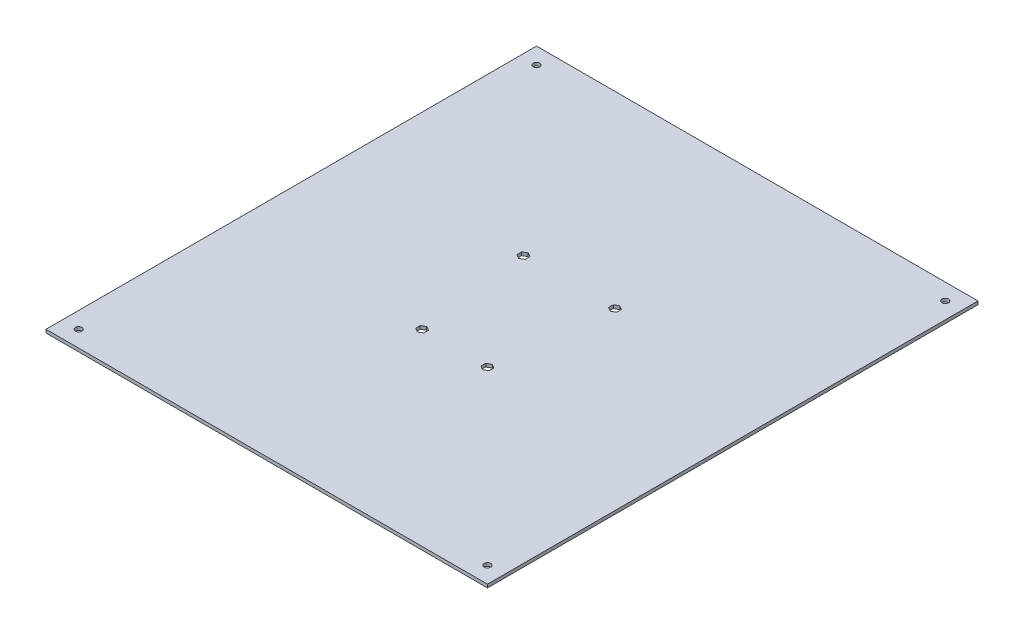
ISO-10303-21;
HEADER;
FILE_DESCRIPTION(('STEP AP214'),'2;1');
FILE_NAME('part.step','',(''),(''),'','','');
FILE_SCHEMA(('AUTOMOTIVE_DESIGN { 1 0 10303 214 1 1 1 1 }'));
ENDSEC;
DATA;
#1=APPLICATION_CONTEXT('core data for automotive mechanical design processes');
#2=APPLICATION_PROTOCOL_DEFINITION('international standard','automotive_design',2000,#1);
#3=PRODUCT_CONTEXT('',#1,'mechanical');
#4=PRODUCT('Part','Part','',(#3));
#5=PRODUCT_RELATED_PRODUCT_CATEGORY('part','',(#4));
#6=PRODUCT_DEFINITION_FORMATION('','',#4);
#7=PRODUCT_DEFINITION_CONTEXT('part definition',#1,'design');
#8=PRODUCT_DEFINITION('design','',#6,#7);
#9=PRODUCT_DEFINITION_SHAPE('','',#8);
#10=(LENGTH_UNIT() NAMED_UNIT(*) SI_UNIT(.MILLI.,.METRE.));
#11=(NAMED_UNIT(*) PLANE_ANGLE_UNIT() SI_UNIT($,.RADIAN.));
#12=(NAMED_UNIT(*) SI_UNIT($,.STERADIAN.) SOLID_ANGLE_UNIT());
#13=UNCERTAINTY_MEASURE_WITH_UNIT(LENGTH_MEASURE(1.E-05),#10,'distance_accuracy_value','');
#14=(GEOMETRIC_REPRESENTATION_CONTEXT(3) GLOBAL_UNCERTAINTY_ASSIGNED_CONTEXT((#13)) GLOBAL_UNIT_ASSIGNED_CONTEXT((#10,
#11,#12)) REPRESENTATION_CONTEXT('',''));
#15=CARTESIAN_POINT('',(0.,0.,0.));
#16=DIRECTION('',(0.,0.,1.));
#17=DIRECTION('',(1.,0.,0.));
#18=AXIS2_PLACEMENT_3D('',#15,#16,#17);
#19=CARTESIAN_POINT('',(0.,2.,0.));
#20=DIRECTION('',(0.,-1.,0.));
#21=DIRECTION('',(0.,0.,-1.));
#22=AXIS2_PLACEMENT_3D('',#19,#20,#21);
#23=PLANE('',#22);
#24=DIRECTION('',(0.856357223631022,0.,0.51638387420113));
#25=VECTOR('',#24,1.);
#26=CARTESIAN_POINT('',(123.982042371858,2.,-205.608507333663));
#27=LINE('',#26,#25);
#28=CARTESIAN_POINT('',(160.472995130533,2.,-183.604442862861));
#29=VERTEX_POINT('',#28);
#30=CARTESIAN_POINT('',(162.945085498462,2.,-182.113771018985));
#31=VERTEX_POINT('',#30);
#32=EDGE_CURVE('E242',#29,#31,#27,.T.);
#33=ORIENTED_EDGE('',*,*,#32,.F.);
#34=DIRECTION('',(-0.0190229413472933,0.,0.999819047479341));
#35=VECTOR('',#34,1.);
#36=CARTESIAN_POINT('',(156.922859863659,2.,2.9856746245851));
#37=LINE('',#36,#35);
#38=CARTESIAN_POINT('',(160.527909632071,2.,-186.490671843876));
#39=VERTEX_POINT('',#38);
#40=EDGE_CURVE('E55',#39,#29,#37,.T.);
#41=ORIENTED_EDGE('',*,*,#40,.F.);
#42=DIRECTION('',(-0.875380164978316,0.,0.483435173278213));
#43=VECTOR('',#42,1.);
#44=CARTESIAN_POINT('',(-41.4039974729137,2.,-74.9722819976583));
#45=LINE('',#44,#43);
#46=CARTESIAN_POINT('',(163.054914501538,2.,-187.886228981016));
#47=VERTEX_POINT('',#46);
#48=EDGE_CURVE('E261',#47,#39,#45,.T.);
#49=ORIENTED_EDGE('',*,*,#48,.F.);
#50=DIRECTION('',(-0.856357223631015,0.,-0.516383874201141));
#51=VECTOR('',#50,1.);
#52=CARTESIAN_POINT('',(126.563961742867,2.,-209.890293451817));
#53=LINE('',#52,#51);
#54=CARTESIAN_POINT('',(165.527004869467,2.,-186.39555713714));
#55=VERTEX_POINT('',#54);
#56=EDGE_CURVE('E254',#55,#47,#53,.T.);
#57=ORIENTED_EDGE('',*,*,#56,.F.);
#58=DIRECTION('',(0.0190229413472933,0.,-0.999819047479341));
#59=VECTOR('',#58,1.);
#60=CARTESIAN_POINT('',(161.921955101056,2.,3.08078933132156));
#61=LINE('',#60,#59);
#62=CARTESIAN_POINT('',(165.472090367929,2.,-183.509328156124));
#63=VERTEX_POINT('',#62);
#64=EDGE_CURVE('E250',#63,#55,#61,.T.);
#65=ORIENTED_EDGE('',*,*,#64,.F.);
#66=DIRECTION('',(0.875380164978318,0.,-0.48343517327821));
#67=VECTOR('',#66,1.);
#68=CARTESIAN_POINT('',(-38.9868216065229,2.,-70.5953811727678));
#69=LINE('',#68,#67);
#70=EDGE_CURVE('E231',#31,#63,#69,.T.);
#71=ORIENTED_EDGE('',*,*,#70,.F.);
#72=EDGE_LOOP('',(#33,#41,#49,#57,#65,#71));
#73=FACE_BOUND('',#72,.T.);
#74=DIRECTION('',(0.852913627072248,0.,0.522052051767315));
#75=VECTOR('',#74,1.);
#76=CARTESIAN_POINT('',(92.1438238417608,2.,-150.541929179528));
#77=LINE('',#76,#75);
#78=CARTESIAN_POINT('',(152.463795090117,2.,-113.621233163866));
#79=VERTEX_POINT('',#78);
#80=CARTESIAN_POINT('',(154.925944651046,2.,-112.114198700772));
#81=VERTEX_POINT('',#80);
#82=EDGE_CURVE('E281',#79,#81,#77,.T.);
#83=ORIENTED_EDGE('',*,*,#82,.F.);
#84=DIRECTION('',(-0.0256535253921588,0.,0.999670894162151));
#85=VECTOR('',#84,1.);
#86=CARTESIAN_POINT('',(149.449632236285,2.,3.83517211295387));
#87=LINE('',#86,#85);
#88=CARTESIAN_POINT('',(152.537850439071,2.,-116.507034463094));
#89=VERTEX_POINT('',#88);
#90=EDGE_CURVE('E63',#89,#79,#87,.T.);
#91=ORIENTED_EDGE('',*,*,#90,.F.);
#92=DIRECTION('',(-0.878567152464407,0.,0.477618842394836));
#93=VECTOR('',#92,1.);
#94=CARTESIAN_POINT('',(-14.0918105488571,2.,-25.9215105603864));
#95=LINE('',#94,#93);
#96=CARTESIAN_POINT('',(155.074055348954,2.,-117.885801299228));
#97=VERTEX_POINT('',#96);
#98=EDGE_CURVE('E298',#97,#89,#95,.T.);
#99=ORIENTED_EDGE('',*,*,#98,.F.);
#100=DIRECTION('',(-0.852913627072248,0.,-0.522052051767315));
#101=VECTOR('',#100,1.);
#102=CARTESIAN_POINT('',(94.7540841005975,2.,-154.80649731489));
#103=LINE('',#102,#101);
#104=CARTESIAN_POINT('',(157.536204909883,2.,-116.378766836134));
#105=VERTEX_POINT('',#104);
#106=EDGE_CURVE('E294',#105,#97,#103,.T.);
#107=ORIENTED_EDGE('',*,*,#106,.F.);
#108=DIRECTION('',(0.0256535253921588,0.,-0.999670894162151));
#109=VECTOR('',#108,1.);
#110=CARTESIAN_POINT('',(154.447986707096,2.,3.96343973991467));
#111=LINE('',#110,#109);
#112=CARTESIAN_POINT('',(157.462149560928,2.,-113.492965536906));
#113=VERTEX_POINT('',#112);
#114=EDGE_CURVE('E290',#113,#105,#111,.T.);
#115=ORIENTED_EDGE('',*,*,#114,.F.);
#116=DIRECTION('',(0.878567152464407,0.,-0.477618842394836));
#117=VECTOR('',#116,1.);
#118=CARTESIAN_POINT('',(-11.7037163368828,2.,-21.5286747980641));
#119=LINE('',#118,#117);
#120=EDGE_CURVE('E286',#81,#113,#119,.T.);
#121=ORIENTED_EDGE('',*,*,#120,.F.);
#122=EDGE_LOOP('',(#83,#91,#99,#107,#115,#121));
#123=FACE_BOUND('',#122,.T.);
#124=DIRECTION('',(-0.878567152464388,0.,-0.47761884239487));
#125=VECTOR('',#124,1.);
#126=CARTESIAN_POINT('',(75.6841453737209,2.,-139.218971668453));
#127=LINE('',#126,#125);
#128=CARTESIAN_POINT('',(117.462149560928,2.,-116.507034463094));
#129=VERTEX_POINT('',#128);
#130=CARTESIAN_POINT('',(114.925944651046,2.,-117.885801299228));
#131=VERTEX_POINT('',#130);
#132=EDGE_CURVE('E323',#129,#131,#127,.T.);
#133=ORIENTED_EDGE('',*,*,#132,.F.);
#134=DIRECTION('',(-0.025653525392122,0.,-0.999670894162152));
#135=VECTOR('',#134,1.);
#136=CARTESIAN_POINT('',(120.372679855148,2.,-3.08900020718311));
#137=LINE('',#136,#135);
#138=CARTESIAN_POINT('',(117.536204909882,2.,-113.621233163866));
#139=VERTEX_POINT('',#138);
#140=EDGE_CURVE('E320',#139,#129,#137,.T.);
#141=ORIENTED_EDGE('',*,*,#140,.F.);
#142=DIRECTION('',(0.852913627072268,0.,-0.522052051767282));
#143=VECTOR('',#142,1.);
#144=CARTESIAN_POINT('',(-18.5584707580579,2.,-30.3202957513246));
#145=LINE('',#144,#143);
#146=CARTESIAN_POINT('',(115.074055348954,2.,-112.114198700772));
#147=VERTEX_POINT('',#146);
#148=EDGE_CURVE('E340',#147,#139,#145,.T.);
#149=ORIENTED_EDGE('',*,*,#148,.F.);
#150=DIRECTION('',(0.87856715246439,0.,0.477618842394869));
#151=VECTOR('',#150,1.);
#152=CARTESIAN_POINT('',(73.2960511617462,2.,-134.826135906131));
#153=LINE('',#152,#151);
#154=CARTESIAN_POINT('',(112.537850439072,2.,-113.492965536906));
#155=VERTEX_POINT('',#154);
#156=EDGE_CURVE('E336',#155,#147,#153,.T.);
#157=ORIENTED_EDGE('',*,*,#156,.F.);
#158=DIRECTION('',(0.0256535253921218,0.,0.999670894162152));
#159=VECTOR('',#158,1.);
#160=CARTESIAN_POINT('',(115.374325384337,2.,-2.96073258022248));
#161=LINE('',#160,#159);
#162=CARTESIAN_POINT('',(112.463795090118,2.,-116.378766836134));
#163=VERTEX_POINT('',#162);
#164=EDGE_CURVE('E332',#163,#155,#161,.T.);
#165=ORIENTED_EDGE('',*,*,#164,.F.);
#166=DIRECTION('',(-0.852913627072266,0.,0.522052051767284));
#167=VECTOR('',#166,1.);
#168=CARTESIAN_POINT('',(-21.1687310168942,2.,-34.5848638866855));
#169=LINE('',#168,#167);
#170=EDGE_CURVE('E328',#131,#163,#169,.T.);
#171=ORIENTED_EDGE('',*,*,#170,.F.);
#172=EDGE_LOOP('',(#133,#141,#149,#157,#165,#171));
#173=FACE_BOUND('',#172,.T.);
#174=DIRECTION('',(-0.875380164978322,0.,-0.483435173278203));
#175=VECTOR('',#174,1.);
#176=CARTESIAN_POINT('',(104.505580498796,2.,-189.233463667622));
#177=LINE('',#176,#175);
#178=CARTESIAN_POINT('',(109.472090367929,2.,-186.490671843876));
#179=VERTEX_POINT('',#178);
#180=CARTESIAN_POINT('',(106.945085498462,2.,-187.886228981015));
#181=VERTEX_POINT('',#180);
#182=EDGE_CURVE('E365',#179,#181,#177,.T.);
#183=ORIENTED_EDGE('',*,*,#182,.F.);
#184=DIRECTION('',(-0.0190229413472837,0.,-0.999819047479342));
#185=VECTOR('',#184,1.);
#186=CARTESIAN_POINT('',(112.979434616013,2.,-2.14959013190244));
#187=LINE('',#186,#185);
#188=CARTESIAN_POINT('',(109.527004869467,2.,-183.604442862861));
#189=VERTEX_POINT('',#188);
#190=EDGE_CURVE('E362',#189,#179,#187,.T.);
#191=ORIENTED_EDGE('',*,*,#190,.F.);
#192=DIRECTION('',(0.856357223631026,0.,-0.516383874201123));
#193=VECTOR('',#192,1.);
#194=CARTESIAN_POINT('',(-51.9859198774171,2.,-86.2120609072131));
#195=LINE('',#194,#193);
#196=CARTESIAN_POINT('',(107.054914501538,2.,-182.113771018985));
#197=VERTEX_POINT('',#196);
#198=EDGE_CURVE('E381',#197,#189,#195,.T.);
#199=ORIENTED_EDGE('',*,*,#198,.F.);
#200=DIRECTION('',(0.875380164978311,0.,0.483435173278223));
#201=VECTOR('',#200,1.);
#202=CARTESIAN_POINT('',(102.08840463241,2.,-184.856562842729));
#203=LINE('',#202,#201);
#204=CARTESIAN_POINT('',(104.527909632071,2.,-183.509328156124));
#205=VERTEX_POINT('',#204);
#206=EDGE_CURVE('E377',#205,#197,#203,.T.);
#207=ORIENTED_EDGE('',*,*,#206,.F.);
#208=DIRECTION('',(0.0190229413472842,0.,0.999819047479342));
#209=VECTOR('',#208,1.);
#210=CARTESIAN_POINT('',(107.980339378617,2.,-2.05447542516609));
#211=LINE('',#210,#209);
#212=CARTESIAN_POINT('',(104.472995130533,2.,-186.39555713714));
#213=VERTEX_POINT('',#212);
#214=EDGE_CURVE('E373',#213,#205,#211,.T.);
#215=ORIENTED_EDGE('',*,*,#214,.F.);
#216=DIRECTION('',(-0.856357223631027,0.,0.516383874201121));
#217=VECTOR('',#216,1.);
#218=CARTESIAN_POINT('',(-54.5678392484226,2.,-90.4938470253685));
#219=LINE('',#218,#217);
#220=EDGE_CURVE('E369',#181,#213,#219,.T.);
#221=ORIENTED_EDGE('',*,*,#220,.F.);
#222=EDGE_LOOP('',(#183,#191,#199,#207,#215,#221));
#223=FACE_BOUND('',#222,.T.);
#224=DIRECTION('',(0.,0.,1.));
#225=VECTOR('',#224,1.);
#226=CARTESIAN_POINT('',(0.,2.,0.));
#227=LINE('',#226,#225);
#228=CARTESIAN_POINT('',(0.,2.,-300.));
#229=VERTEX_POINT('',#228);
#230=CARTESIAN_POINT('',(0.,2.,0.));
#231=VERTEX_POINT('',#230);
#232=EDGE_CURVE('E435',#229,#231,#227,.T.);
#233=ORIENTED_EDGE('',*,*,#232,.T.);
#234=DIRECTION('',(1.,0.,0.));
#235=VECTOR('',#234,1.);
#236=CARTESIAN_POINT('',(0.,2.,0.));
#237=LINE('',#236,#235);
#238=CARTESIAN_POINT('',(270.,2.,0.));
#239=VERTEX_POINT('',#238);
#240=EDGE_CURVE('E439',#231,#239,#237,.T.);
#241=ORIENTED_EDGE('',*,*,#240,.T.);
#242=DIRECTION('',(0.,0.,-1.));
#243=VECTOR('',#242,1.);
#244=CARTESIAN_POINT('',(270.,2.,0.));
#245=LINE('',#244,#243);
#246=CARTESIAN_POINT('',(270.,2.,-300.));
#247=VERTEX_POINT('',#246);
#248=EDGE_CURVE('E443',#239,#247,#245,.T.);
#249=ORIENTED_EDGE('',*,*,#248,.T.);
#250=DIRECTION('',(-1.,0.,0.));
#251=VECTOR('',#250,1.);
#252=CARTESIAN_POINT('',(0.,2.,-300.));
#253=LINE('',#252,#251);
#254=EDGE_CURVE('E446',#247,#229,#253,.T.);
#255=ORIENTED_EDGE('',*,*,#254,.T.);
#256=EDGE_LOOP('',(#233,#241,#249,#255));
#257=FACE_BOUND('',#256,.T.);
#258=CARTESIAN_POINT('',(10.,2.,-290.));
#259=DIRECTION('',(0.,1.,0.));
#260=DIRECTION('',(0.,0.,1.));
#261=AXIS2_PLACEMENT_3D('',#258,#259,#260);
#262=CIRCLE('',#261,2.);
#263=CARTESIAN_POINT('',(10.,2.,-288.));
#264=VERTEX_POINT('',#263);
#265=EDGE_CURVE('E427',#264,#264,#262,.T.);
#266=ORIENTED_EDGE('',*,*,#265,.F.);
#267=EDGE_LOOP('',(#266));
#268=FACE_BOUND('',#267,.T.);
#269=CARTESIAN_POINT('',(10.,2.,-10.));
#270=DIRECTION('',(0.,1.,0.));
#271=DIRECTION('',(0.,0.,-1.));
#272=AXIS2_PLACEMENT_3D('',#269,#270,#271);
#273=CIRCLE('',#272,2.);
#274=CARTESIAN_POINT('',(10.,2.,-12.));
#275=VERTEX_POINT('',#274);
#276=EDGE_CURVE('E419',#275,#275,#273,.T.);
#277=ORIENTED_EDGE('',*,*,#276,.F.);
#278=EDGE_LOOP('',(#277));
#279=FACE_BOUND('',#278,.T.);
#280=CARTESIAN_POINT('',(260.,2.,-10.));
#281=DIRECTION('',(0.,1.,0.));
#282=DIRECTION('',(0.,0.,1.));
#283=AXIS2_PLACEMENT_3D('',#280,#281,#282);
#284=CIRCLE('',#283,2.);
#285=CARTESIAN_POINT('',(260.,2.,-8.00000000000001));
#286=VERTEX_POINT('',#285);
#287=EDGE_CURVE('E411',#286,#286,#284,.T.);
#288=ORIENTED_EDGE('',*,*,#287,.F.);
#289=EDGE_LOOP('',(#288));
#290=FACE_BOUND('',#289,.T.);
#291=CARTESIAN_POINT('',(260.,2.,-290.));
#292=DIRECTION('',(0.,1.,0.));
#293=DIRECTION('',(0.,0.,-1.));
#294=AXIS2_PLACEMENT_3D('',#291,#292,#293);
#295=CIRCLE('',#294,2.);
#296=CARTESIAN_POINT('',(260.,2.,-292.));
#297=VERTEX_POINT('',#296);
#298=EDGE_CURVE('E403',#297,#297,#295,.T.);
#299=ORIENTED_EDGE('',*,*,#298,.F.);
#300=EDGE_LOOP('',(#299));
#301=FACE_BOUND('',#300,.T.);
#302=ADVANCED_FACE('F39',(#73,#123,#173,#223,#257,#268,#279,#290,#301),#23,.F.);
#303=CARTESIAN_POINT('',(0.,0.,0.));
#304=DIRECTION('',(0.,-1.,0.));
#305=DIRECTION('',(0.,0.,-1.));
#306=AXIS2_PLACEMENT_3D('',#303,#304,#305);
#307=PLANE('',#306);
#308=DIRECTION('',(0.0190229413472933,0.,-0.999819047479341));
#309=VECTOR('',#308,1.);
#310=CARTESIAN_POINT('',(156.922859863659,0.,2.9856746245851));
#311=LINE('',#310,#309);
#312=CARTESIAN_POINT('',(160.472995130533,0.,-183.604442862861));
#313=VERTEX_POINT('',#312);
#314=CARTESIAN_POINT('',(160.527909632071,0.,-186.490671843876));
#315=VERTEX_POINT('',#314);
#316=EDGE_CURVE('E11',#313,#315,#311,.T.);
#317=ORIENTED_EDGE('',*,*,#316,.F.);
#318=DIRECTION('',(-0.856357223631022,0.,-0.51638387420113));
#319=VECTOR('',#318,1.);
#320=CARTESIAN_POINT('',(123.982042371858,0.,-205.608507333663));
#321=LINE('',#320,#319);
#322=CARTESIAN_POINT('',(162.945085498462,0.,-182.113771018985));
#323=VERTEX_POINT('',#322);
#324=EDGE_CURVE('E533',#323,#313,#321,.T.);
#325=ORIENTED_EDGE('',*,*,#324,.F.);
#326=DIRECTION('',(-0.875380164978318,0.,0.48343517327821));
#327=VECTOR('',#326,1.);
#328=CARTESIAN_POINT('',(-38.9868216065229,0.,-70.5953811727678));
#329=LINE('',#328,#327);
#330=CARTESIAN_POINT('',(165.472090367929,0.,-183.509328156124));
#331=VERTEX_POINT('',#330);
#332=EDGE_CURVE('E234',#331,#323,#329,.T.);
#333=ORIENTED_EDGE('',*,*,#332,.F.);
#334=DIRECTION('',(-0.0190229413472933,0.,0.999819047479341));
#335=VECTOR('',#334,1.);
#336=CARTESIAN_POINT('',(161.921955101056,0.,3.08078933132156));
#337=LINE('',#336,#335);
#338=CARTESIAN_POINT('',(165.527004869467,0.,-186.39555713714));
#339=VERTEX_POINT('',#338);
#340=EDGE_CURVE('E538',#339,#331,#337,.T.);
#341=ORIENTED_EDGE('',*,*,#340,.F.);
#342=DIRECTION('',(0.856357223631015,0.,0.516383874201141));
#343=VECTOR('',#342,1.);
#344=CARTESIAN_POINT('',(126.563961742867,0.,-209.890293451817));
#345=LINE('',#344,#343);
#346=CARTESIAN_POINT('',(163.054914501538,0.,-187.886228981016));
#347=VERTEX_POINT('',#346);
#348=EDGE_CURVE('E541',#347,#339,#345,.T.);
#349=ORIENTED_EDGE('',*,*,#348,.F.);
#350=DIRECTION('',(0.875380164978316,0.,-0.483435173278213));
#351=VECTOR('',#350,1.);
#352=CARTESIAN_POINT('',(-41.4039974729137,0.,-74.9722819976583));
#353=LINE('',#352,#351);
#354=EDGE_CURVE('E48',#315,#347,#353,.T.);
#355=ORIENTED_EDGE('',*,*,#354,.F.);
#356=EDGE_LOOP('',(#317,#325,#333,#341,#349,#355));
#357=FACE_BOUND('',#356,.T.);
#358=DIRECTION('',(0.0256535253921588,0.,-0.999670894162151));
#359=VECTOR('',#358,1.);
#360=CARTESIAN_POINT('',(149.449632236285,0.,3.83517211295387));
#361=LINE('',#360,#359);
#362=CARTESIAN_POINT('',(152.463795090117,0.,-113.621233163866));
#363=VERTEX_POINT('',#362);
#364=CARTESIAN_POINT('',(152.537850439071,0.,-116.507034463094));
#365=VERTEX_POINT('',#364);
#366=EDGE_CURVE('E530',#363,#365,#361,.T.);
#367=ORIENTED_EDGE('',*,*,#366,.F.);
#368=DIRECTION('',(-0.852913627072248,0.,-0.522052051767315));
#369=VECTOR('',#368,1.);
#370=CARTESIAN_POINT('',(92.1438238417608,0.,-150.541929179528));
#371=LINE('',#370,#369);
#372=CARTESIAN_POINT('',(154.925944651046,0.,-112.114198700772));
#373=VERTEX_POINT('',#372);
#374=EDGE_CURVE('E514',#373,#363,#371,.T.);
#375=ORIENTED_EDGE('',*,*,#374,.F.);
#376=DIRECTION('',(-0.878567152464407,0.,0.477618842394837));
#377=VECTOR('',#376,1.);
#378=CARTESIAN_POINT('',(-11.7037163368828,0.,-21.5286747980641));
#379=LINE('',#378,#377);
#380=CARTESIAN_POINT('',(157.462149560928,0.,-113.492965536906));
#381=VERTEX_POINT('',#380);
#382=EDGE_CURVE('E517',#381,#373,#379,.T.);
#383=ORIENTED_EDGE('',*,*,#382,.F.);
#384=DIRECTION('',(-0.0256535253921588,0.,0.999670894162151));
#385=VECTOR('',#384,1.);
#386=CARTESIAN_POINT('',(154.447986707096,0.,3.96343973991467));
#387=LINE('',#386,#385);
#388=CARTESIAN_POINT('',(157.536204909883,0.,-116.378766836134));
#389=VERTEX_POINT('',#388);
#390=EDGE_CURVE('E521',#389,#381,#387,.T.);
#391=ORIENTED_EDGE('',*,*,#390,.F.);
#392=DIRECTION('',(0.852913627072248,0.,0.522052051767315));
#393=VECTOR('',#392,1.);
#394=CARTESIAN_POINT('',(94.7540841005975,0.,-154.80649731489));
#395=LINE('',#394,#393);
#396=CARTESIAN_POINT('',(155.074055348954,0.,-117.885801299228));
#397=VERTEX_POINT('',#396);
#398=EDGE_CURVE('E524',#397,#389,#395,.T.);
#399=ORIENTED_EDGE('',*,*,#398,.F.);
#400=DIRECTION('',(0.878567152464407,0.,-0.477618842394837));
#401=VECTOR('',#400,1.);
#402=CARTESIAN_POINT('',(-14.0918105488571,0.,-25.9215105603864));
#403=LINE('',#402,#401);
#404=EDGE_CURVE('E527',#365,#397,#403,.T.);
#405=ORIENTED_EDGE('',*,*,#404,.F.);
#406=EDGE_LOOP('',(#367,#375,#383,#391,#399,#405));
#407=FACE_BOUND('',#406,.T.);
#408=DIRECTION('',(0.025653525392122,0.,0.999670894162152));
#409=VECTOR('',#408,1.);
#410=CARTESIAN_POINT('',(120.372679855148,0.,-3.08900020718311));
#411=LINE('',#410,#409);
#412=CARTESIAN_POINT('',(117.462149560928,0.,-116.507034463094));
#413=VERTEX_POINT('',#412);
#414=CARTESIAN_POINT('',(117.536204909882,0.,-113.621233163866));
#415=VERTEX_POINT('',#414);
#416=EDGE_CURVE('E511',#413,#415,#411,.T.);
#417=ORIENTED_EDGE('',*,*,#416,.F.);
#418=DIRECTION('',(0.878567152464388,0.,0.47761884239487));
#419=VECTOR('',#418,1.);
#420=CARTESIAN_POINT('',(75.6841453737209,0.,-139.218971668453));
#421=LINE('',#420,#419);
#422=CARTESIAN_POINT('',(114.925944651046,0.,-117.885801299228));
#423=VERTEX_POINT('',#422);
#424=EDGE_CURVE('E495',#423,#413,#421,.T.);
#425=ORIENTED_EDGE('',*,*,#424,.F.);
#426=DIRECTION('',(0.852913627072266,0.,-0.522052051767284));
#427=VECTOR('',#426,1.);
#428=CARTESIAN_POINT('',(-21.1687310168942,0.,-34.5848638866855));
#429=LINE('',#428,#427);
#430=CARTESIAN_POINT('',(112.463795090118,0.,-116.378766836134));
#431=VERTEX_POINT('',#430);
#432=EDGE_CURVE('E498',#431,#423,#429,.T.);
#433=ORIENTED_EDGE('',*,*,#432,.F.);
#434=DIRECTION('',(-0.0256535253921218,0.,-0.999670894162152));
#435=VECTOR('',#434,1.);
#436=CARTESIAN_POINT('',(115.374325384337,0.,-2.96073258022248));
#437=LINE('',#436,#435);
#438=CARTESIAN_POINT('',(112.537850439072,0.,-113.492965536906));
#439=VERTEX_POINT('',#438);
#440=EDGE_CURVE('E502',#439,#431,#437,.T.);
#441=ORIENTED_EDGE('',*,*,#440,.F.);
#442=DIRECTION('',(-0.878567152464389,0.,-0.477618842394869));
#443=VECTOR('',#442,1.);
#444=CARTESIAN_POINT('',(73.2960511617462,0.,-134.826135906131));
#445=LINE('',#444,#443);
#446=CARTESIAN_POINT('',(115.074055348954,0.,-112.114198700772));
#447=VERTEX_POINT('',#446);
#448=EDGE_CURVE('E505',#447,#439,#445,.T.);
#449=ORIENTED_EDGE('',*,*,#448,.F.);
#450=DIRECTION('',(-0.852913627072268,0.,0.522052051767282));
#451=VECTOR('',#450,1.);
#452=CARTESIAN_POINT('',(-18.5584707580579,0.,-30.3202957513246));
#453=LINE('',#452,#451);
#454=EDGE_CURVE('E508',#415,#447,#453,.T.);
#455=ORIENTED_EDGE('',*,*,#454,.F.);
#456=EDGE_LOOP('',(#417,#425,#433,#441,#449,#455));
#457=FACE_BOUND('',#456,.T.);
#458=DIRECTION('',(0.0190229413472837,0.,0.999819047479342));
#459=VECTOR('',#458,1.);
#460=CARTESIAN_POINT('',(112.979434616013,0.,-2.14959013190244));
#461=LINE('',#460,#459);
#462=CARTESIAN_POINT('',(109.472090367929,0.,-186.490671843876));
#463=VERTEX_POINT('',#462);
#464=CARTESIAN_POINT('',(109.527004869467,0.,-183.604442862861));
#465=VERTEX_POINT('',#464);
#466=EDGE_CURVE('E492',#463,#465,#461,.T.);
#467=ORIENTED_EDGE('',*,*,#466,.F.);
#468=DIRECTION('',(0.875380164978322,0.,0.483435173278203));
#469=VECTOR('',#468,1.);
#470=CARTESIAN_POINT('',(104.505580498796,0.,-189.233463667622));
#471=LINE('',#470,#469);
#472=CARTESIAN_POINT('',(106.945085498462,0.,-187.886228981016));
#473=VERTEX_POINT('',#472);
#474=EDGE_CURVE('E476',#473,#463,#471,.T.);
#475=ORIENTED_EDGE('',*,*,#474,.F.);
#476=DIRECTION('',(0.856357223631027,0.,-0.516383874201121));
#477=VECTOR('',#476,1.);
#478=CARTESIAN_POINT('',(-54.5678392484226,0.,-90.4938470253685));
#479=LINE('',#478,#477);
#480=CARTESIAN_POINT('',(104.472995130533,0.,-186.39555713714));
#481=VERTEX_POINT('',#480);
#482=EDGE_CURVE('E479',#481,#473,#479,.T.);
#483=ORIENTED_EDGE('',*,*,#482,.F.);
#484=DIRECTION('',(-0.0190229413472842,0.,-0.999819047479342));
#485=VECTOR('',#484,1.);
#486=CARTESIAN_POINT('',(107.980339378617,0.,-2.05447542516609));
#487=LINE('',#486,#485);
#488=CARTESIAN_POINT('',(104.527909632071,0.,-183.509328156124));
#489=VERTEX_POINT('',#488);
#490=EDGE_CURVE('E483',#489,#481,#487,.T.);
#491=ORIENTED_EDGE('',*,*,#490,.F.);
#492=DIRECTION('',(-0.875380164978311,0.,-0.483435173278223));
#493=VECTOR('',#492,1.);
#494=CARTESIAN_POINT('',(102.08840463241,0.,-184.856562842729));
#495=LINE('',#494,#493);
#496=CARTESIAN_POINT('',(107.054914501538,0.,-182.113771018985));
#497=VERTEX_POINT('',#496);
#498=EDGE_CURVE('E486',#497,#489,#495,.T.);
#499=ORIENTED_EDGE('',*,*,#498,.F.);
#500=DIRECTION('',(-0.856357223631026,0.,0.516383874201123));
#501=VECTOR('',#500,1.);
#502=CARTESIAN_POINT('',(-51.9859198774171,0.,-86.2120609072131));
#503=LINE('',#502,#501);
#504=EDGE_CURVE('E489',#465,#497,#503,.T.);
#505=ORIENTED_EDGE('',*,*,#504,.F.);
#506=EDGE_LOOP('',(#467,#475,#483,#491,#499,#505));
#507=FACE_BOUND('',#506,.T.);
#508=CARTESIAN_POINT('',(260.,0.,-10.));
#509=DIRECTION('',(0.,1.,0.));
#510=DIRECTION('',(0.,0.,1.));
#511=AXIS2_PLACEMENT_3D('',#508,#509,#510);
#512=CIRCLE('',#511,2.);
#513=CARTESIAN_POINT('',(260.,0.,-8.00000000000001));
#514=VERTEX_POINT('',#513);
#515=EDGE_CURVE('E407',#514,#514,#512,.T.);
#516=ORIENTED_EDGE('',*,*,#515,.T.);
#517=EDGE_LOOP('',(#516));
#518=FACE_BOUND('',#517,.T.);
#519=CARTESIAN_POINT('',(10.,0.,-290.));
#520=DIRECTION('',(0.,1.,0.));
#521=DIRECTION('',(0.,0.,1.));
#522=AXIS2_PLACEMENT_3D('',#519,#520,#521);
#523=CIRCLE('',#522,2.);
#524=CARTESIAN_POINT('',(10.,0.,-288.));
#525=VERTEX_POINT('',#524);
#526=EDGE_CURVE('E423',#525,#525,#523,.T.);
#527=ORIENTED_EDGE('',*,*,#526,.T.);
#528=EDGE_LOOP('',(#527));
#529=FACE_BOUND('',#528,.T.);
#530=DIRECTION('',(0.,0.,1.));
#531=VECTOR('',#530,1.);
#532=CARTESIAN_POINT('',(0.,0.,0.));
#533=LINE('',#532,#531);
#534=CARTESIAN_POINT('',(0.,0.,-300.));
#535=VERTEX_POINT('',#534);
#536=CARTESIAN_POINT('',(0.,0.,0.));
#537=VERTEX_POINT('',#536);
#538=EDGE_CURVE('E431',#535,#537,#533,.T.);
#539=ORIENTED_EDGE('',*,*,#538,.F.);
#540=DIRECTION('',(-1.,0.,0.));
#541=VECTOR('',#540,1.);
#542=CARTESIAN_POINT('',(0.,0.,-300.));
#543=LINE('',#542,#541);
#544=CARTESIAN_POINT('',(270.,0.,-300.));
#545=VERTEX_POINT('',#544);
#546=EDGE_CURVE('E440',#545,#535,#543,.T.);
#547=ORIENTED_EDGE('',*,*,#546,.F.);
#548=DIRECTION('',(0.,0.,-1.));
#549=VECTOR('',#548,1.);
#550=CARTESIAN_POINT('',(270.,0.,0.));
#551=LINE('',#550,#549);
#552=CARTESIAN_POINT('',(270.,0.,0.));
#553=VERTEX_POINT('',#552);
#554=EDGE_CURVE('E456',#553,#545,#551,.T.);
#555=ORIENTED_EDGE('',*,*,#554,.F.);
#556=DIRECTION('',(1.,0.,0.));
#557=VECTOR('',#556,1.);
#558=CARTESIAN_POINT('',(0.,0.,0.));
#559=LINE('',#558,#557);
#560=EDGE_CURVE('E453',#537,#553,#559,.T.);
#561=ORIENTED_EDGE('',*,*,#560,.F.);
#562=EDGE_LOOP('',(#539,#547,#555,#561));
#563=FACE_BOUND('',#562,.T.);
#564=CARTESIAN_POINT('',(10.,0.,-10.));
#565=DIRECTION('',(0.,1.,0.));
#566=DIRECTION('',(0.,0.,-1.));
#567=AXIS2_PLACEMENT_3D('',#564,#565,#566);
#568=CIRCLE('',#567,2.);
#569=CARTESIAN_POINT('',(10.,0.,-12.));
#570=VERTEX_POINT('',#569);
#571=EDGE_CURVE('E415',#570,#570,#568,.T.);
#572=ORIENTED_EDGE('',*,*,#571,.T.);
#573=EDGE_LOOP('',(#572));
#574=FACE_BOUND('',#573,.T.);
#575=CARTESIAN_POINT('',(260.,0.,-290.));
#576=DIRECTION('',(0.,1.,0.));
#577=DIRECTION('',(0.,0.,-1.));
#578=AXIS2_PLACEMENT_3D('',#575,#576,#577);
#579=CIRCLE('',#578,2.);
#580=CARTESIAN_POINT('',(260.,0.,-292.));
#581=VERTEX_POINT('',#580);
#582=EDGE_CURVE('E268',#581,#581,#579,.T.);
#583=ORIENTED_EDGE('',*,*,#582,.T.);
#584=EDGE_LOOP('',(#583));
#585=FACE_BOUND('',#584,.T.);
#586=ADVANCED_FACE('F557',(#357,#407,#457,#507,#518,#529,#563,#574,#585),#307,.T.);
#587=CARTESIAN_POINT('',(0.,2.,0.));
#588=DIRECTION('',(1.,0.,0.));
#589=DIRECTION('',(0.,0.,-1.));
#590=AXIS2_PLACEMENT_3D('',#587,#588,#589);
#591=PLANE('',#590);
#592=ORIENTED_EDGE('',*,*,#538,.T.);
#593=DIRECTION('',(0.,-1.,0.));
#594=VECTOR('',#593,1.);
#595=CARTESIAN_POINT('',(0.,2.,0.));
#596=LINE('',#595,#594);
#597=EDGE_CURVE('E472',#231,#537,#596,.T.);
#598=ORIENTED_EDGE('',*,*,#597,.F.);
#599=ORIENTED_EDGE('',*,*,#232,.F.);
#600=DIRECTION('',(0.,-1.,0.));
#601=VECTOR('',#600,1.);
#602=CARTESIAN_POINT('',(0.,2.,-300.));
#603=LINE('',#602,#601);
#604=EDGE_CURVE('E449',#229,#535,#603,.T.);
#605=ORIENTED_EDGE('',*,*,#604,.T.);
#606=EDGE_LOOP('',(#592,#598,#599,#605));
#607=FACE_BOUND('',#606,.T.);
#608=ADVANCED_FACE('F41',(#607),#591,.F.);
#609=CARTESIAN_POINT('',(0.,2.,0.));
#610=DIRECTION('',(0.,0.,-1.));
#611=DIRECTION('',(-1.,0.,0.));
#612=AXIS2_PLACEMENT_3D('',#609,#610,#611);
#613=PLANE('',#612);
#614=ORIENTED_EDGE('',*,*,#560,.T.);
#615=DIRECTION('',(0.,-1.,0.));
#616=VECTOR('',#615,1.);
#617=CARTESIAN_POINT('',(270.,2.,0.));
#618=LINE('',#617,#616);
#619=EDGE_CURVE('E468',#239,#553,#618,.T.);
#620=ORIENTED_EDGE('',*,*,#619,.F.);
#621=ORIENTED_EDGE('',*,*,#240,.F.);
#622=ORIENTED_EDGE('',*,*,#597,.T.);
#623=EDGE_LOOP('',(#614,#620,#621,#622));
#624=FACE_BOUND('',#623,.T.);
#625=ADVANCED_FACE('F586',(#624),#613,.F.);
#626=CARTESIAN_POINT('',(270.,2.,0.));
#627=DIRECTION('',(-1.,0.,0.));
#628=DIRECTION('',(0.,0.,1.));
#629=AXIS2_PLACEMENT_3D('',#626,#627,#628);
#630=PLANE('',#629);
#631=ORIENTED_EDGE('',*,*,#554,.T.);
#632=DIRECTION('',(0.,-1.,0.));
#633=VECTOR('',#632,1.);
#634=CARTESIAN_POINT('',(270.,2.,-300.));
#635=LINE('',#634,#633);
#636=EDGE_CURVE('E464',#247,#545,#635,.T.);
#637=ORIENTED_EDGE('',*,*,#636,.F.);
#638=ORIENTED_EDGE('',*,*,#248,.F.);
#639=ORIENTED_EDGE('',*,*,#619,.T.);
#640=EDGE_LOOP('',(#631,#637,#638,#639));
#641=FACE_BOUND('',#640,.T.);
#642=ADVANCED_FACE('F583',(#641),#630,.F.);
#643=CARTESIAN_POINT('',(0.,2.,-300.));
#644=DIRECTION('',(0.,0.,1.));
#645=DIRECTION('',(1.,0.,0.));
#646=AXIS2_PLACEMENT_3D('',#643,#644,#645);
#647=PLANE('',#646);
#648=ORIENTED_EDGE('',*,*,#546,.T.);
#649=ORIENTED_EDGE('',*,*,#604,.F.);
#650=ORIENTED_EDGE('',*,*,#254,.F.);
#651=ORIENTED_EDGE('',*,*,#636,.T.);
#652=EDGE_LOOP('',(#648,#649,#650,#651));
#653=FACE_BOUND('',#652,.T.);
#654=ADVANCED_FACE('F580',(#653),#647,.F.);
#655=CARTESIAN_POINT('',(10.,2.,-290.));
#656=DIRECTION('',(0.,-1.,0.));
#657=DIRECTION('',(0.,0.,-1.));
#658=AXIS2_PLACEMENT_3D('',#655,#656,#657);
#659=CYLINDRICAL_SURFACE('',#658,2.);
#660=ORIENTED_EDGE('',*,*,#265,.T.);
#661=EDGE_LOOP('',(#660));
#662=FACE_BOUND('',#661,.T.);
#663=ORIENTED_EDGE('',*,*,#526,.F.);
#664=EDGE_LOOP('',(#663));
#665=FACE_BOUND('',#664,.T.);
#666=ADVANCED_FACE('F577',(#662,#665),#659,.F.);
#667=CARTESIAN_POINT('',(10.,2.,-10.));
#668=DIRECTION('',(0.,-1.,0.));
#669=DIRECTION('',(0.,0.,-1.));
#670=AXIS2_PLACEMENT_3D('',#667,#668,#669);
#671=CYLINDRICAL_SURFACE('',#670,2.);
#672=ORIENTED_EDGE('',*,*,#276,.T.);
#673=EDGE_LOOP('',(#672));
#674=FACE_BOUND('',#673,.T.);
#675=ORIENTED_EDGE('',*,*,#571,.F.);
#676=EDGE_LOOP('',(#675));
#677=FACE_BOUND('',#676,.T.);
#678=ADVANCED_FACE('F631',(#674,#677),#671,.F.);
#679=CARTESIAN_POINT('',(260.,2.,-10.));
#680=DIRECTION('',(0.,-1.,0.));
#681=DIRECTION('',(0.,0.,-1.));
#682=AXIS2_PLACEMENT_3D('',#679,#680,#681);
#683=CYLINDRICAL_SURFACE('',#682,2.);
#684=ORIENTED_EDGE('',*,*,#287,.T.);
#685=EDGE_LOOP('',(#684));
#686=FACE_BOUND('',#685,.T.);
#687=ORIENTED_EDGE('',*,*,#515,.F.);
#688=EDGE_LOOP('',(#687));
#689=FACE_BOUND('',#688,.T.);
#690=ADVANCED_FACE('F620',(#686,#689),#683,.F.);
#691=CARTESIAN_POINT('',(260.,2.,-290.));
#692=DIRECTION('',(0.,-1.,0.));
#693=DIRECTION('',(0.,0.,-1.));
#694=AXIS2_PLACEMENT_3D('',#691,#692,#693);
#695=CYLINDRICAL_SURFACE('',#694,2.);
#696=ORIENTED_EDGE('',*,*,#298,.T.);
#697=EDGE_LOOP('',(#696));
#698=FACE_BOUND('',#697,.T.);
#699=ORIENTED_EDGE('',*,*,#582,.F.);
#700=EDGE_LOOP('',(#699));
#701=FACE_BOUND('',#700,.T.);
#702=ADVANCED_FACE('F616',(#698,#701),#695,.F.);
#703=CARTESIAN_POINT('',(112.979434616013,-143.,-2.14959013190244));
#704=DIRECTION('',(0.999819047479341,0.,-0.0190229413472837));
#705=DIRECTION('',(-0.0190229413472837,0.,-0.999819047479342));
#706=AXIS2_PLACEMENT_3D('',#703,#704,#705);
#707=PLANE('',#706);
#708=ORIENTED_EDGE('',*,*,#466,.T.);
#709=DIRECTION('',(0.,1.,0.));
#710=VECTOR('',#709,1.);
#711=CARTESIAN_POINT('',(109.527004869467,-143.,-183.604442862861));
#712=LINE('',#711,#710);
#713=EDGE_CURVE('E324',#465,#189,#712,.T.);
#714=ORIENTED_EDGE('',*,*,#713,.T.);
#715=ORIENTED_EDGE('',*,*,#190,.T.);
#716=DIRECTION('',(0.,1.,0.));
#717=VECTOR('',#716,1.);
#718=CARTESIAN_POINT('',(109.472090367929,-143.,-186.490671843876));
#719=LINE('',#718,#717);
#720=EDGE_CURVE('E385',#463,#179,#719,.T.);
#721=ORIENTED_EDGE('',*,*,#720,.F.);
#722=EDGE_LOOP('',(#708,#714,#715,#721));
#723=FACE_BOUND('',#722,.T.);
#724=ADVANCED_FACE('F619',(#723),#707,.F.);
#725=CARTESIAN_POINT('',(-51.9859198774171,-143.,-86.2120609072131));
#726=DIRECTION('',(0.516383874201123,0.,0.856357223631026));
#727=DIRECTION('',(0.856357223631026,0.,-0.516383874201123));
#728=AXIS2_PLACEMENT_3D('',#725,#726,#727);
#729=PLANE('',#728);
#730=ORIENTED_EDGE('',*,*,#504,.T.);
#731=DIRECTION('',(0.,1.,0.));
#732=VECTOR('',#731,1.);
#733=CARTESIAN_POINT('',(107.054914501538,-143.,-182.113771018985));
#734=LINE('',#733,#732);
#735=EDGE_CURVE('E388',#497,#197,#734,.T.);
#736=ORIENTED_EDGE('',*,*,#735,.T.);
#737=ORIENTED_EDGE('',*,*,#198,.T.);
#738=ORIENTED_EDGE('',*,*,#713,.F.);
#739=EDGE_LOOP('',(#730,#736,#737,#738));
#740=FACE_BOUND('',#739,.T.);
#741=ADVANCED_FACE('F628',(#740),#729,.F.);
#742=CARTESIAN_POINT('',(102.08840463241,-143.,-184.856562842729));
#743=DIRECTION('',(-0.483435173278223,0.,0.875380164978311));
#744=DIRECTION('',(0.875380164978311,0.,0.483435173278223));
#745=AXIS2_PLACEMENT_3D('',#742,#743,#744);
#746=PLANE('',#745);
#747=ORIENTED_EDGE('',*,*,#498,.T.);
#748=DIRECTION('',(0.,1.,0.));
#749=VECTOR('',#748,1.);
#750=CARTESIAN_POINT('',(104.527909632071,-143.,-183.509328156124));
#751=LINE('',#750,#749);
#752=EDGE_CURVE('E391',#489,#205,#751,.T.);
#753=ORIENTED_EDGE('',*,*,#752,.T.);
#754=ORIENTED_EDGE('',*,*,#206,.T.);
#755=ORIENTED_EDGE('',*,*,#735,.F.);
#756=EDGE_LOOP('',(#747,#753,#754,#755));
#757=FACE_BOUND('',#756,.T.);
#758=ADVANCED_FACE('F690',(#757),#746,.F.);
#759=CARTESIAN_POINT('',(107.980339378617,-143.,-2.05447542516609));
#760=DIRECTION('',(-0.999819047479341,0.,0.0190229413472842));
#761=DIRECTION('',(0.0190229413472842,0.,0.999819047479342));
#762=AXIS2_PLACEMENT_3D('',#759,#760,#761);
#763=PLANE('',#762);
#764=ORIENTED_EDGE('',*,*,#490,.T.);
#765=DIRECTION('',(0.,1.,0.));
#766=VECTOR('',#765,1.);
#767=CARTESIAN_POINT('',(104.472995130533,-143.,-186.39555713714));
#768=LINE('',#767,#766);
#769=EDGE_CURVE('E394',#481,#213,#768,.T.);
#770=ORIENTED_EDGE('',*,*,#769,.T.);
#771=ORIENTED_EDGE('',*,*,#214,.T.);
#772=ORIENTED_EDGE('',*,*,#752,.F.);
#773=EDGE_LOOP('',(#764,#770,#771,#772));
#774=FACE_BOUND('',#773,.T.);
#775=ADVANCED_FACE('F700',(#774),#763,.F.);
#776=CARTESIAN_POINT('',(-54.5678392484226,-143.,-90.4938470253685));
#777=DIRECTION('',(-0.516383874201121,0.,-0.856357223631027));
#778=DIRECTION('',(-0.856357223631027,0.,0.516383874201121));
#779=AXIS2_PLACEMENT_3D('',#776,#777,#778);
#780=PLANE('',#779);
#781=ORIENTED_EDGE('',*,*,#482,.T.);
#782=DIRECTION('',(0.,1.,0.));
#783=VECTOR('',#782,1.);
#784=CARTESIAN_POINT('',(106.945085498462,-143.,-187.886228981015));
#785=LINE('',#784,#783);
#786=EDGE_CURVE('E397',#473,#181,#785,.T.);
#787=ORIENTED_EDGE('',*,*,#786,.T.);
#788=ORIENTED_EDGE('',*,*,#220,.T.);
#789=ORIENTED_EDGE('',*,*,#769,.F.);
#790=EDGE_LOOP('',(#781,#787,#788,#789));
#791=FACE_BOUND('',#790,.T.);
#792=ADVANCED_FACE('F710',(#791),#780,.F.);
#793=CARTESIAN_POINT('',(104.505580498796,-143.,-189.233463667622));
#794=DIRECTION('',(0.483435173278203,0.,-0.875380164978322));
#795=DIRECTION('',(-0.875380164978322,0.,-0.483435173278203));
#796=AXIS2_PLACEMENT_3D('',#793,#794,#795);
#797=PLANE('',#796);
#798=ORIENTED_EDGE('',*,*,#474,.T.);
#799=ORIENTED_EDGE('',*,*,#720,.T.);
#800=ORIENTED_EDGE('',*,*,#182,.T.);
#801=ORIENTED_EDGE('',*,*,#786,.F.);
#802=EDGE_LOOP('',(#798,#799,#800,#801));
#803=FACE_BOUND('',#802,.T.);
#804=ADVANCED_FACE('F720',(#803),#797,.F.);
#805=CARTESIAN_POINT('',(120.372679855148,-143.,-3.08900020718311));
#806=DIRECTION('',(0.999670894162152,0.,-0.025653525392122));
#807=DIRECTION('',(-0.025653525392122,0.,-0.999670894162152));
#808=AXIS2_PLACEMENT_3D('',#805,#806,#807);
#809=PLANE('',#808);
#810=ORIENTED_EDGE('',*,*,#416,.T.);
#811=DIRECTION('',(0.,1.,0.));
#812=VECTOR('',#811,1.);
#813=CARTESIAN_POINT('',(117.536204909882,-143.,-113.621233163866));
#814=LINE('',#813,#812);
#815=EDGE_CURVE('E282',#415,#139,#814,.T.);
#816=ORIENTED_EDGE('',*,*,#815,.T.);
#817=ORIENTED_EDGE('',*,*,#140,.T.);
#818=DIRECTION('',(0.,1.,0.));
#819=VECTOR('',#818,1.);
#820=CARTESIAN_POINT('',(117.462149560928,-143.,-116.507034463094));
#821=LINE('',#820,#819);
#822=EDGE_CURVE('E344',#413,#129,#821,.T.);
#823=ORIENTED_EDGE('',*,*,#822,.F.);
#824=EDGE_LOOP('',(#810,#816,#817,#823));
#825=FACE_BOUND('',#824,.T.);
#826=ADVANCED_FACE('F730',(#825),#809,.F.);
#827=CARTESIAN_POINT('',(-18.5584707580579,-143.,-30.3202957513246));
#828=DIRECTION('',(0.522052051767282,0.,0.852913627072267));
#829=DIRECTION('',(0.852913627072268,0.,-0.522052051767282));
#830=AXIS2_PLACEMENT_3D('',#827,#828,#829);
#831=PLANE('',#830);
#832=ORIENTED_EDGE('',*,*,#454,.T.);
#833=DIRECTION('',(0.,1.,0.));
#834=VECTOR('',#833,1.);
#835=CARTESIAN_POINT('',(115.074055348954,-143.,-112.114198700772));
#836=LINE('',#835,#834);
#837=EDGE_CURVE('E347',#447,#147,#836,.T.);
#838=ORIENTED_EDGE('',*,*,#837,.T.);
#839=ORIENTED_EDGE('',*,*,#148,.T.);
#840=ORIENTED_EDGE('',*,*,#815,.F.);
#841=EDGE_LOOP('',(#832,#838,#839,#840));
#842=FACE_BOUND('',#841,.T.);
#843=ADVANCED_FACE('F739',(#842),#831,.F.);
#844=CARTESIAN_POINT('',(73.2960511617462,-143.,-134.826135906131));
#845=DIRECTION('',(-0.477618842394869,0.,0.878567152464389));
#846=DIRECTION('',(0.878567152464389,0.,0.477618842394869));
#847=AXIS2_PLACEMENT_3D('',#844,#845,#846);
#848=PLANE('',#847);
#849=ORIENTED_EDGE('',*,*,#448,.T.);
#850=DIRECTION('',(0.,1.,0.));
#851=VECTOR('',#850,1.);
#852=CARTESIAN_POINT('',(112.537850439072,-143.,-113.492965536906));
#853=LINE('',#852,#851);
#854=EDGE_CURVE('E350',#439,#155,#853,.T.);
#855=ORIENTED_EDGE('',*,*,#854,.T.);
#856=ORIENTED_EDGE('',*,*,#156,.T.);
#857=ORIENTED_EDGE('',*,*,#837,.F.);
#858=EDGE_LOOP('',(#849,#855,#856,#857));
#859=FACE_BOUND('',#858,.T.);
#860=ADVANCED_FACE('F749',(#859),#848,.F.);
#861=CARTESIAN_POINT('',(115.374325384337,-143.,-2.96073258022248));
#862=DIRECTION('',(-0.999670894162152,0.,0.0256535253921218));
#863=DIRECTION('',(0.0256535253921218,0.,0.999670894162152));
#864=AXIS2_PLACEMENT_3D('',#861,#862,#863);
#865=PLANE('',#864);
#866=ORIENTED_EDGE('',*,*,#440,.T.);
#867=DIRECTION('',(0.,1.,0.));
#868=VECTOR('',#867,1.);
#869=CARTESIAN_POINT('',(112.463795090118,-143.,-116.378766836134));
#870=LINE('',#869,#868);
#871=EDGE_CURVE('E353',#431,#163,#870,.T.);
#872=ORIENTED_EDGE('',*,*,#871,.T.);
#873=ORIENTED_EDGE('',*,*,#164,.T.);
#874=ORIENTED_EDGE('',*,*,#854,.F.);
#875=EDGE_LOOP('',(#866,#872,#873,#874));
#876=FACE_BOUND('',#875,.T.);
#877=ADVANCED_FACE('F759',(#876),#865,.F.);
#878=CARTESIAN_POINT('',(-21.1687310168942,-143.,-34.5848638866855));
#879=DIRECTION('',(-0.522052051767284,0.,-0.852913627072266));
#880=DIRECTION('',(-0.852913627072266,0.,0.522052051767284));
#881=AXIS2_PLACEMENT_3D('',#878,#879,#880);
#882=PLANE('',#881);
#883=ORIENTED_EDGE('',*,*,#432,.T.);
#884=DIRECTION('',(0.,1.,0.));
#885=VECTOR('',#884,1.);
#886=CARTESIAN_POINT('',(114.925944651046,-143.,-117.885801299228));
#887=LINE('',#886,#885);
#888=EDGE_CURVE('E356',#423,#131,#887,.T.);
#889=ORIENTED_EDGE('',*,*,#888,.T.);
#890=ORIENTED_EDGE('',*,*,#170,.T.);
#891=ORIENTED_EDGE('',*,*,#871,.F.);
#892=EDGE_LOOP('',(#883,#889,#890,#891));
#893=FACE_BOUND('',#892,.T.);
#894=ADVANCED_FACE('F769',(#893),#882,.F.);
#895=CARTESIAN_POINT('',(75.6841453737209,-143.,-139.218971668453));
#896=DIRECTION('',(0.47761884239487,0.,-0.878567152464388));
#897=DIRECTION('',(-0.878567152464388,0.,-0.47761884239487));
#898=AXIS2_PLACEMENT_3D('',#895,#896,#897);
#899=PLANE('',#898);
#900=ORIENTED_EDGE('',*,*,#424,.T.);
#901=ORIENTED_EDGE('',*,*,#822,.T.);
#902=ORIENTED_EDGE('',*,*,#132,.T.);
#903=ORIENTED_EDGE('',*,*,#888,.F.);
#904=EDGE_LOOP('',(#900,#901,#902,#903));
#905=FACE_BOUND('',#904,.T.);
#906=ADVANCED_FACE('F779',(#905),#899,.F.);
#907=CARTESIAN_POINT('',(149.449632236285,-143.,3.83517211295387));
#908=DIRECTION('',(-0.999670894162151,0.,-0.0256535253921588));
#909=DIRECTION('',(-0.0256535253921588,0.,0.999670894162151));
#910=AXIS2_PLACEMENT_3D('',#907,#908,#909);
#911=PLANE('',#910);
#912=ORIENTED_EDGE('',*,*,#366,.T.);
#913=DIRECTION('',(0.,1.,0.));
#914=VECTOR('',#913,1.);
#915=CARTESIAN_POINT('',(152.537850439071,-143.,-116.507034463094));
#916=LINE('',#915,#914);
#917=EDGE_CURVE('E303',#365,#89,#916,.T.);
#918=ORIENTED_EDGE('',*,*,#917,.T.);
#919=ORIENTED_EDGE('',*,*,#90,.T.);
#920=DIRECTION('',(0.,1.,0.));
#921=VECTOR('',#920,1.);
#922=CARTESIAN_POINT('',(152.463795090117,-143.,-113.621233163866));
#923=LINE('',#922,#921);
#924=EDGE_CURVE('E302',#363,#79,#923,.T.);
#925=ORIENTED_EDGE('',*,*,#924,.F.);
#926=EDGE_LOOP('',(#912,#918,#919,#925));
#927=FACE_BOUND('',#926,.T.);
#928=ADVANCED_FACE('F789',(#927),#911,.F.);
#929=CARTESIAN_POINT('',(-14.0918105488571,-143.,-25.9215105603864));
#930=DIRECTION('',(-0.477618842394837,0.,-0.878567152464407));
#931=DIRECTION('',(-0.878567152464407,0.,0.477618842394837));
#932=AXIS2_PLACEMENT_3D('',#929,#930,#931);
#933=PLANE('',#932);
#934=ORIENTED_EDGE('',*,*,#404,.T.);
#935=DIRECTION('',(0.,1.,0.));
#936=VECTOR('',#935,1.);
#937=CARTESIAN_POINT('',(155.074055348954,-143.,-117.885801299228));
#938=LINE('',#937,#936);
#939=EDGE_CURVE('E306',#397,#97,#938,.T.);
#940=ORIENTED_EDGE('',*,*,#939,.T.);
#941=ORIENTED_EDGE('',*,*,#98,.T.);
#942=ORIENTED_EDGE('',*,*,#917,.F.);
#943=EDGE_LOOP('',(#934,#940,#941,#942));
#944=FACE_BOUND('',#943,.T.);
#945=ADVANCED_FACE('F799',(#944),#933,.F.);
#946=CARTESIAN_POINT('',(94.7540841005975,-143.,-154.80649731489));
#947=DIRECTION('',(0.522052051767315,0.,-0.852913627072248));
#948=DIRECTION('',(-0.852913627072248,0.,-0.522052051767315));
#949=AXIS2_PLACEMENT_3D('',#946,#947,#948);
#950=PLANE('',#949);
#951=ORIENTED_EDGE('',*,*,#398,.T.);
#952=DIRECTION('',(0.,1.,0.));
#953=VECTOR('',#952,1.);
#954=CARTESIAN_POINT('',(157.536204909883,-143.,-116.378766836134));
#955=LINE('',#954,#953);
#956=EDGE_CURVE('E309',#389,#105,#955,.T.);
#957=ORIENTED_EDGE('',*,*,#956,.T.);
#958=ORIENTED_EDGE('',*,*,#106,.T.);
#959=ORIENTED_EDGE('',*,*,#939,.F.);
#960=EDGE_LOOP('',(#951,#957,#958,#959));
#961=FACE_BOUND('',#960,.T.);
#962=ADVANCED_FACE('F808',(#961),#950,.F.);
#963=CARTESIAN_POINT('',(154.447986707096,-143.,3.96343973991467));
#964=DIRECTION('',(0.999670894162151,0.,0.0256535253921588));
#965=DIRECTION('',(0.0256535253921588,0.,-0.999670894162151));
#966=AXIS2_PLACEMENT_3D('',#963,#964,#965);
#967=PLANE('',#966);
#968=ORIENTED_EDGE('',*,*,#390,.T.);
#969=DIRECTION('',(0.,1.,0.));
#970=VECTOR('',#969,1.);
#971=CARTESIAN_POINT('',(157.462149560928,-143.,-113.492965536906));
#972=LINE('',#971,#970);
#973=EDGE_CURVE('E312',#381,#113,#972,.T.);
#974=ORIENTED_EDGE('',*,*,#973,.T.);
#975=ORIENTED_EDGE('',*,*,#114,.T.);
#976=ORIENTED_EDGE('',*,*,#956,.F.);
#977=EDGE_LOOP('',(#968,#974,#975,#976));
#978=FACE_BOUND('',#977,.T.);
#979=ADVANCED_FACE('F818',(#978),#967,.F.);
#980=CARTESIAN_POINT('',(-11.7037163368828,-143.,-21.5286747980641));
#981=DIRECTION('',(0.477618842394837,0.,0.878567152464407));
#982=DIRECTION('',(0.878567152464407,0.,-0.477618842394837));
#983=AXIS2_PLACEMENT_3D('',#980,#981,#982);
#984=PLANE('',#983);
#985=ORIENTED_EDGE('',*,*,#382,.T.);
#986=DIRECTION('',(0.,1.,0.));
#987=VECTOR('',#986,1.);
#988=CARTESIAN_POINT('',(154.925944651046,-143.,-112.114198700772));
#989=LINE('',#988,#987);
#990=EDGE_CURVE('E315',#373,#81,#989,.T.);
#991=ORIENTED_EDGE('',*,*,#990,.T.);
#992=ORIENTED_EDGE('',*,*,#120,.T.);
#993=ORIENTED_EDGE('',*,*,#973,.F.);
#994=EDGE_LOOP('',(#985,#991,#992,#993));
#995=FACE_BOUND('',#994,.T.);
#996=ADVANCED_FACE('F828',(#995),#984,.F.);
#997=CARTESIAN_POINT('',(92.1438238417608,-143.,-150.541929179528));
#998=DIRECTION('',(-0.522052051767315,0.,0.852913627072248));
#999=DIRECTION('',(0.852913627072248,0.,0.522052051767315));
#1000=AXIS2_PLACEMENT_3D('',#997,#998,#999);
#1001=PLANE('',#1000);
#1002=ORIENTED_EDGE('',*,*,#374,.T.);
#1003=ORIENTED_EDGE('',*,*,#924,.T.);
#1004=ORIENTED_EDGE('',*,*,#82,.T.);
#1005=ORIENTED_EDGE('',*,*,#990,.F.);
#1006=EDGE_LOOP('',(#1002,#1003,#1004,#1005));
#1007=FACE_BOUND('',#1006,.T.);
#1008=ADVANCED_FACE('F838',(#1007),#1001,.F.);
#1009=CARTESIAN_POINT('',(156.922859863659,-143.,2.9856746245851));
#1010=DIRECTION('',(-0.999819047479341,0.,-0.0190229413472933));
#1011=DIRECTION('',(-0.0190229413472933,0.,0.999819047479341));
#1012=AXIS2_PLACEMENT_3D('',#1009,#1010,#1011);
#1013=PLANE('',#1012);
#1014=ORIENTED_EDGE('',*,*,#316,.T.);
#1015=DIRECTION('',(0.,1.,0.));
#1016=VECTOR('',#1015,1.);
#1017=CARTESIAN_POINT('',(160.527909632071,-143.,-186.490671843876));
#1018=LINE('',#1017,#1016);
#1019=EDGE_CURVE('E265',#315,#39,#1018,.T.);
#1020=ORIENTED_EDGE('',*,*,#1019,.T.);
#1021=ORIENTED_EDGE('',*,*,#40,.T.);
#1022=DIRECTION('',(0.,1.,0.));
#1023=VECTOR('',#1022,1.);
#1024=CARTESIAN_POINT('',(160.472995130533,-143.,-183.604442862861));
#1025=LINE('',#1024,#1023);
#1026=EDGE_CURVE('E239',#313,#29,#1025,.T.);
#1027=ORIENTED_EDGE('',*,*,#1026,.F.);
#1028=EDGE_LOOP('',(#1014,#1020,#1021,#1027));
#1029=FACE_BOUND('',#1028,.T.);
#1030=ADVANCED_FACE('F848',(#1029),#1013,.F.);
#1031=CARTESIAN_POINT('',(-41.4039974729137,-143.,-74.9722819976583));
#1032=DIRECTION('',(-0.483435173278213,0.,-0.875380164978316));
#1033=DIRECTION('',(-0.875380164978316,0.,0.483435173278213));
#1034=AXIS2_PLACEMENT_3D('',#1031,#1032,#1033);
#1035=PLANE('',#1034);
#1036=ORIENTED_EDGE('',*,*,#354,.T.);
#1037=DIRECTION('',(0.,1.,0.));
#1038=VECTOR('',#1037,1.);
#1039=CARTESIAN_POINT('',(163.054914501538,-143.,-187.886228981016));
#1040=LINE('',#1039,#1038);
#1041=EDGE_CURVE('E269',#347,#47,#1040,.T.);
#1042=ORIENTED_EDGE('',*,*,#1041,.T.);
#1043=ORIENTED_EDGE('',*,*,#48,.T.);
#1044=ORIENTED_EDGE('',*,*,#1019,.F.);
#1045=EDGE_LOOP('',(#1036,#1042,#1043,#1044));
#1046=FACE_BOUND('',#1045,.T.);
#1047=ADVANCED_FACE('F548',(#1046),#1035,.F.);
#1048=CARTESIAN_POINT('',(126.563961742867,-143.,-209.890293451817));
#1049=DIRECTION('',(0.516383874201141,0.,-0.856357223631015));
#1050=DIRECTION('',(-0.856357223631015,0.,-0.516383874201141));
#1051=AXIS2_PLACEMENT_3D('',#1048,#1049,#1050);
#1052=PLANE('',#1051);
#1053=ORIENTED_EDGE('',*,*,#348,.T.);
#1054=DIRECTION('',(0.,1.,0.));
#1055=VECTOR('',#1054,1.);
#1056=CARTESIAN_POINT('',(165.527004869467,-143.,-186.39555713714));
#1057=LINE('',#1056,#1055);
#1058=EDGE_CURVE('E272',#339,#55,#1057,.T.);
#1059=ORIENTED_EDGE('',*,*,#1058,.T.);
#1060=ORIENTED_EDGE('',*,*,#56,.T.);
#1061=ORIENTED_EDGE('',*,*,#1041,.F.);
#1062=EDGE_LOOP('',(#1053,#1059,#1060,#1061));
#1063=FACE_BOUND('',#1062,.T.);
#1064=ADVANCED_FACE('F553',(#1063),#1052,.F.);
#1065=CARTESIAN_POINT('',(161.921955101056,-143.,3.08078933132156));
#1066=DIRECTION('',(0.999819047479341,0.,0.0190229413472933));
#1067=DIRECTION('',(0.0190229413472933,0.,-0.999819047479341));
#1068=AXIS2_PLACEMENT_3D('',#1065,#1066,#1067);
#1069=PLANE('',#1068);
#1070=ORIENTED_EDGE('',*,*,#340,.T.);
#1071=DIRECTION('',(0.,1.,0.));
#1072=VECTOR('',#1071,1.);
#1073=CARTESIAN_POINT('',(165.472090367929,-143.,-183.509328156124));
#1074=LINE('',#1073,#1072);
#1075=EDGE_CURVE('E238',#331,#63,#1074,.T.);
#1076=ORIENTED_EDGE('',*,*,#1075,.T.);
#1077=ORIENTED_EDGE('',*,*,#64,.T.);
#1078=ORIENTED_EDGE('',*,*,#1058,.F.);
#1079=EDGE_LOOP('',(#1070,#1076,#1077,#1078));
#1080=FACE_BOUND('',#1079,.T.);
#1081=ADVANCED_FACE('F560',(#1080),#1069,.F.);
#1082=CARTESIAN_POINT('',(-38.9868216065229,-143.,-70.5953811727678));
#1083=DIRECTION('',(0.48343517327821,0.,0.875380164978318));
#1084=DIRECTION('',(0.875380164978318,0.,-0.48343517327821));
#1085=AXIS2_PLACEMENT_3D('',#1082,#1083,#1084);
#1086=PLANE('',#1085);
#1087=ORIENTED_EDGE('',*,*,#332,.T.);
#1088=DIRECTION('',(0.,1.,0.));
#1089=VECTOR('',#1088,1.);
#1090=CARTESIAN_POINT('',(162.945085498462,-143.,-182.113771018985));
#1091=LINE('',#1090,#1089);
#1092=EDGE_CURVE('E226',#323,#31,#1091,.T.);
#1093=ORIENTED_EDGE('',*,*,#1092,.T.);
#1094=ORIENTED_EDGE('',*,*,#70,.T.);
#1095=ORIENTED_EDGE('',*,*,#1075,.F.);
#1096=EDGE_LOOP('',(#1087,#1093,#1094,#1095));
#1097=FACE_BOUND('',#1096,.T.);
#1098=ADVANCED_FACE('F228',(#1097),#1086,.F.);
#1099=CARTESIAN_POINT('',(123.982042371858,-143.,-205.608507333663));
#1100=DIRECTION('',(-0.51638387420113,0.,0.856357223631022));
#1101=DIRECTION('',(0.856357223631022,0.,0.51638387420113));
#1102=AXIS2_PLACEMENT_3D('',#1099,#1100,#1101);
#1103=PLANE('',#1102);
#1104=ORIENTED_EDGE('',*,*,#324,.T.);
#1105=ORIENTED_EDGE('',*,*,#1026,.T.);
#1106=ORIENTED_EDGE('',*,*,#32,.T.);
#1107=ORIENTED_EDGE('',*,*,#1092,.F.);
#1108=EDGE_LOOP('',(#1104,#1105,#1106,#1107));
#1109=FACE_BOUND('',#1108,.T.);
#1110=ADVANCED_FACE('F243',(#1109),#1103,.F.);
#1111=CLOSED_SHELL('',(#302,#586,#608,#625,#642,#654,#666,#678,#690,#702,#724,#741,#758,#775,
#792,#804,#826,#843,#860,#877,#894,#906,#928,#945,#962,#979,#996,#1008,#1030,#1047,#1064,#1081,
#1098,#1110));
#1112=MANIFOLD_SOLID_BREP('B2',#1111);
#1113=ADVANCED_BREP_SHAPE_REPRESENTATION('',(#18,#1112),#14);
#1114=SHAPE_DEFINITION_REPRESENTATION(#9,#1113);
ENDSEC;
END-ISO-10303-21;
